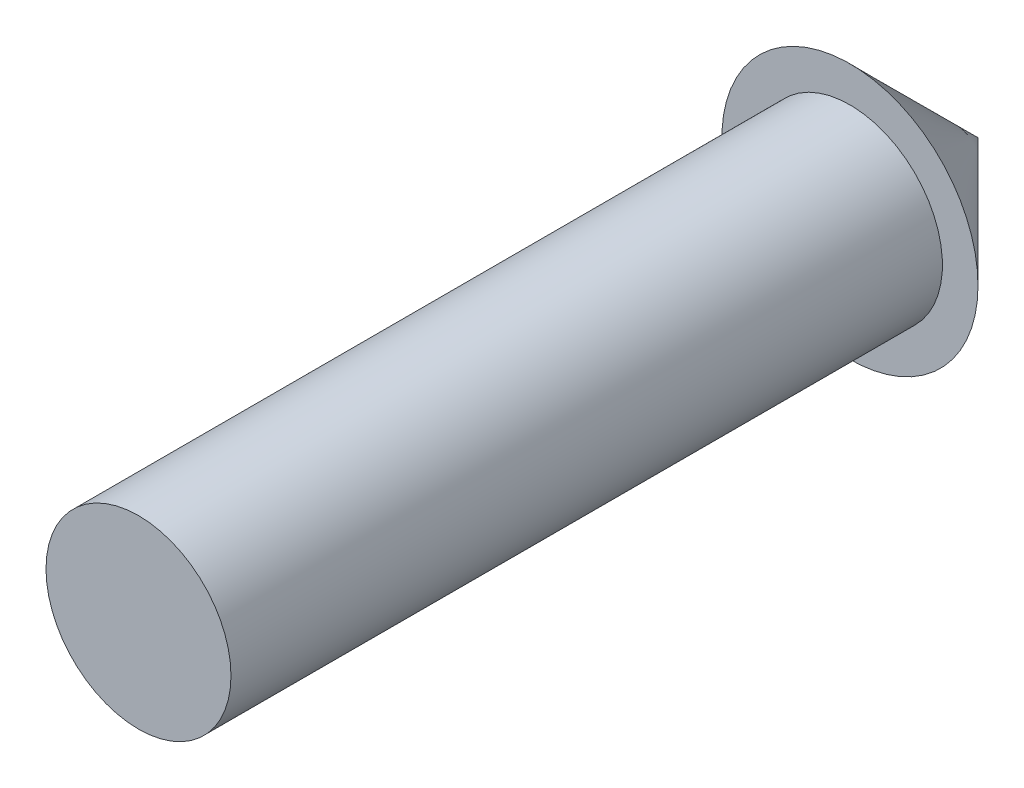
ISO-10303-21;
HEADER;
FILE_DESCRIPTION(('STEP AP214'),'2;1');
FILE_NAME('part.step','',(''),(''),'','','');
FILE_SCHEMA(('AUTOMOTIVE_DESIGN { 1 0 10303 214 1 1 1 1 }'));
ENDSEC;
DATA;
#1=APPLICATION_CONTEXT('core data for automotive mechanical design processes');
#2=APPLICATION_PROTOCOL_DEFINITION('international standard','automotive_design',2000,#1);
#3=PRODUCT_CONTEXT('',#1,'mechanical');
#4=PRODUCT('Part','Part','',(#3));
#5=PRODUCT_RELATED_PRODUCT_CATEGORY('part','',(#4));
#6=PRODUCT_DEFINITION_FORMATION('','',#4);
#7=PRODUCT_DEFINITION_CONTEXT('part definition',#1,'design');
#8=PRODUCT_DEFINITION('design','',#6,#7);
#9=PRODUCT_DEFINITION_SHAPE('','',#8);
#10=(LENGTH_UNIT() NAMED_UNIT(*) SI_UNIT(.MILLI.,.METRE.));
#11=(NAMED_UNIT(*) PLANE_ANGLE_UNIT() SI_UNIT($,.RADIAN.));
#12=(NAMED_UNIT(*) SI_UNIT($,.STERADIAN.) SOLID_ANGLE_UNIT());
#13=UNCERTAINTY_MEASURE_WITH_UNIT(LENGTH_MEASURE(1.E-05),#10,'distance_accuracy_value','');
#14=(GEOMETRIC_REPRESENTATION_CONTEXT(3) GLOBAL_UNCERTAINTY_ASSIGNED_CONTEXT((#13)) GLOBAL_UNIT_ASSIGNED_CONTEXT((#10,
#11,#12)) REPRESENTATION_CONTEXT('',''));
#15=CARTESIAN_POINT('',(0.,0.,0.));
#16=DIRECTION('',(0.,0.,1.));
#17=DIRECTION('',(1.,0.,0.));
#18=AXIS2_PLACEMENT_3D('',#15,#16,#17);
#19=CARTESIAN_POINT('',(-18.,0.,0.));
#20=DIRECTION('',(0.,0.,-1.));
#21=DIRECTION('',(-1.,0.,0.));
#22=AXIS2_PLACEMENT_3D('',#19,#20,#21);
#23=PLANE('',#22);
#24=CARTESIAN_POINT('',(0.,0.,0.));
#25=DIRECTION('',(0.,0.,1.));
#26=DIRECTION('',(1.,0.,0.));
#27=AXIS2_PLACEMENT_3D('',#24,#25,#26);
#28=CIRCLE('',#27,18.);
#29=CARTESIAN_POINT('',(18.,0.,0.));
#30=VERTEX_POINT('',#29);
#31=EDGE_CURVE('E39',#30,#30,#28,.T.);
#32=ORIENTED_EDGE('',*,*,#31,.T.);
#33=EDGE_LOOP('',(#32));
#34=FACE_BOUND('',#33,.T.);
#35=CARTESIAN_POINT('',(0.,0.,0.));
#36=DIRECTION('',(0.,0.,-1.));
#37=DIRECTION('',(-1.,0.,0.));
#38=AXIS2_PLACEMENT_3D('',#35,#36,#37);
#39=CIRCLE('',#38,13.);
#40=CARTESIAN_POINT('',(-13.,0.,0.));
#41=VERTEX_POINT('',#40);
#42=EDGE_CURVE('E11',#41,#41,#39,.F.);
#43=ORIENTED_EDGE('',*,*,#42,.F.);
#44=EDGE_LOOP('',(#43));
#45=FACE_BOUND('',#44,.T.);
#46=ADVANCED_FACE('F32',(#34,#45),#23,.F.);
#47=CARTESIAN_POINT('',(0.,0.,-18.));
#48=DIRECTION('',(0.,0.,1.));
#49=DIRECTION('',(1.,0.,0.));
#50=AXIS2_PLACEMENT_3D('',#47,#48,#49);
#51=CONICAL_SURFACE('',#50,0.,0.785398163397448);
#52=ORIENTED_EDGE('',*,*,#31,.F.);
#53=EDGE_LOOP('',(#52));
#54=FACE_BOUND('',#53,.T.);
#55=CARTESIAN_POINT('',(0.,0.,-18.));
#56=VERTEX_POINT('',#55);
#57=VERTEX_LOOP('',#56);
#58=FACE_BOUND('',#57,.T.);
#59=ADVANCED_FACE('F34',(#54,#58),#51,.T.);
#60=CARTESIAN_POINT('',(0.,0.,100.));
#61=DIRECTION('',(0.,0.,-1.));
#62=DIRECTION('',(-1.,0.,0.));
#63=AXIS2_PLACEMENT_3D('',#60,#61,#62);
#64=CYLINDRICAL_SURFACE('',#63,13.);
#65=CARTESIAN_POINT('',(0.,0.,100.));
#66=DIRECTION('',(0.,0.,1.));
#67=DIRECTION('',(1.,0.,0.));
#68=AXIS2_PLACEMENT_3D('',#65,#66,#67);
#69=CIRCLE('',#68,13.);
#70=CARTESIAN_POINT('',(13.,0.,100.));
#71=VERTEX_POINT('',#70);
#72=EDGE_CURVE('E55',#71,#71,#69,.T.);
#73=ORIENTED_EDGE('',*,*,#72,.F.);
#74=EDGE_LOOP('',(#73));
#75=FACE_BOUND('',#74,.T.);
#76=ORIENTED_EDGE('',*,*,#42,.T.);
#77=EDGE_LOOP('',(#76));
#78=FACE_BOUND('',#77,.T.);
#79=ADVANCED_FACE('F43',(#75,#78),#64,.T.);
#80=CARTESIAN_POINT('',(0.,0.,100.));
#81=DIRECTION('',(0.,0.,1.));
#82=DIRECTION('',(1.,0.,0.));
#83=AXIS2_PLACEMENT_3D('',#80,#81,#82);
#84=PLANE('',#83);
#85=ORIENTED_EDGE('',*,*,#72,.T.);
#86=EDGE_LOOP('',(#85));
#87=FACE_BOUND('',#86,.T.);
#88=ADVANCED_FACE('F49',(#87),#84,.T.);
#89=CLOSED_SHELL('',(#46,#59,#79,#88));
#90=MANIFOLD_SOLID_BREP('B2',#89);
#91=ADVANCED_BREP_SHAPE_REPRESENTATION('',(#18,#90),#14);
#92=SHAPE_DEFINITION_REPRESENTATION(#9,#91);
ENDSEC;
END-ISO-10303-21;
